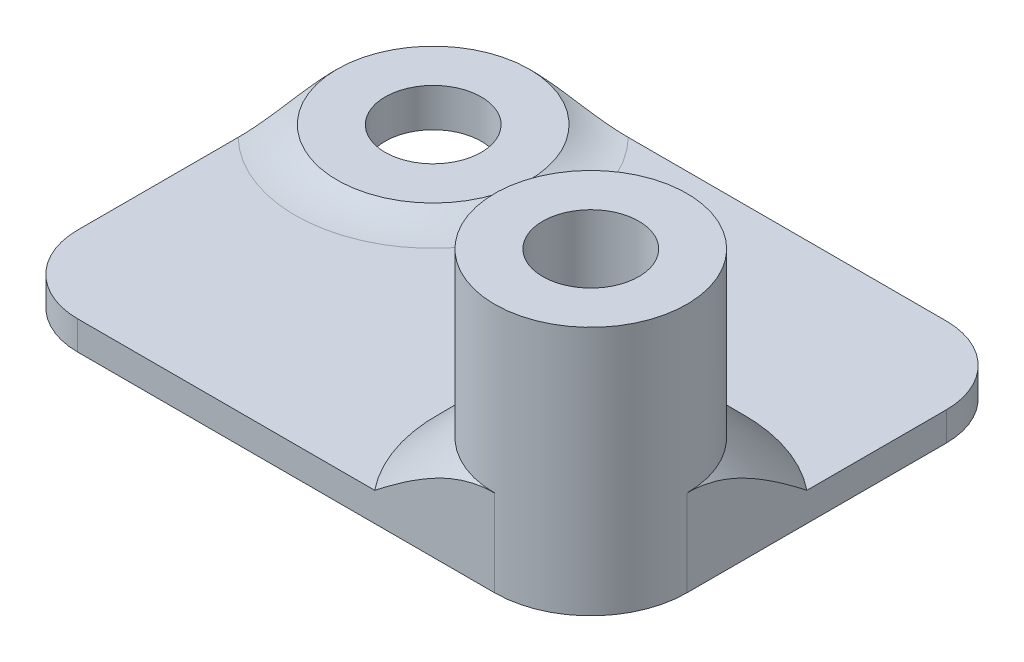
ISO-10303-21;
HEADER;
FILE_DESCRIPTION(('STEP AP214'),'2;1');
FILE_NAME('part.step','',(''),(''),'','','');
FILE_SCHEMA(('AUTOMOTIVE_DESIGN { 1 0 10303 214 1 1 1 1 }'));
ENDSEC;
DATA;
#1=APPLICATION_CONTEXT('core data for automotive mechanical design processes');
#2=APPLICATION_PROTOCOL_DEFINITION('international standard','automotive_design',2000,#1);
#3=PRODUCT_CONTEXT('',#1,'mechanical');
#4=PRODUCT('Part','Part','',(#3));
#5=PRODUCT_RELATED_PRODUCT_CATEGORY('part','',(#4));
#6=PRODUCT_DEFINITION_FORMATION('','',#4);
#7=PRODUCT_DEFINITION_CONTEXT('part definition',#1,'design');
#8=PRODUCT_DEFINITION('design','',#6,#7);
#9=PRODUCT_DEFINITION_SHAPE('','',#8);
#10=(LENGTH_UNIT() NAMED_UNIT(*) SI_UNIT(.MILLI.,.METRE.));
#11=(NAMED_UNIT(*) PLANE_ANGLE_UNIT() SI_UNIT($,.RADIAN.));
#12=(NAMED_UNIT(*) SI_UNIT($,.STERADIAN.) SOLID_ANGLE_UNIT());
#13=UNCERTAINTY_MEASURE_WITH_UNIT(LENGTH_MEASURE(1.E-05),#10,'distance_accuracy_value','');
#14=(GEOMETRIC_REPRESENTATION_CONTEXT(3) GLOBAL_UNCERTAINTY_ASSIGNED_CONTEXT((#13)) GLOBAL_UNIT_ASSIGNED_CONTEXT((#10,
#11,#12)) REPRESENTATION_CONTEXT('',''));
#15=CARTESIAN_POINT('',(0.,0.,0.));
#16=DIRECTION('',(0.,0.,1.));
#17=DIRECTION('',(1.,0.,0.));
#18=AXIS2_PLACEMENT_3D('',#15,#16,#17);
#19=CARTESIAN_POINT('',(0.,0.,0.));
#20=DIRECTION('',(0.,1.,0.));
#21=DIRECTION('',(0.,0.,1.));
#22=AXIS2_PLACEMENT_3D('',#19,#20,#21);
#23=PLANE('',#22);
#24=DIRECTION('',(0.,0.,1.));
#25=VECTOR('',#24,1.);
#26=CARTESIAN_POINT('',(-25.7,0.,0.));
#27=LINE('',#26,#25);
#28=CARTESIAN_POINT('',(-25.7,0.,-7.34786503304665));
#29=VERTEX_POINT('',#28);
#30=CARTESIAN_POINT('',(-25.7,0.,1.));
#31=VERTEX_POINT('',#30);
#32=EDGE_CURVE('E129',#29,#31,#27,.T.);
#33=ORIENTED_EDGE('',*,*,#32,.T.);
#34=CARTESIAN_POINT('',(-21.7,0.,1.));
#35=DIRECTION('',(0.,1.,0.));
#36=DIRECTION('',(0.,0.,1.));
#37=AXIS2_PLACEMENT_3D('',#34,#35,#36);
#38=CIRCLE('',#37,4.);
#39=CARTESIAN_POINT('',(-21.7,0.,5.));
#40=VERTEX_POINT('',#39);
#41=EDGE_CURVE('E232',#31,#40,#38,.T.);
#42=ORIENTED_EDGE('',*,*,#41,.T.);
#43=DIRECTION('',(1.,0.,0.));
#44=VECTOR('',#43,1.);
#45=CARTESIAN_POINT('',(0.,0.,5.));
#46=LINE('',#45,#44);
#47=CARTESIAN_POINT('',(-6.2449979983984,0.,5.));
#48=VERTEX_POINT('',#47);
#49=EDGE_CURVE('E162',#40,#48,#46,.T.);
#50=ORIENTED_EDGE('',*,*,#49,.T.);
#51=CARTESIAN_POINT('',(0.,0.,0.));
#52=DIRECTION('',(0.,1.,0.));
#53=DIRECTION('',(0.,0.,1.));
#54=AXIS2_PLACEMENT_3D('',#51,#52,#53);
#55=CIRCLE('',#54,8.);
#56=CARTESIAN_POINT('',(5.,0.,-6.2449979983984));
#57=VERTEX_POINT('',#56);
#58=EDGE_CURVE('E249',#48,#57,#55,.F.);
#59=ORIENTED_EDGE('',*,*,#58,.T.);
#60=DIRECTION('',(0.,0.,1.));
#61=VECTOR('',#60,1.);
#62=CARTESIAN_POINT('',(5.,0.,0.));
#63=LINE('',#62,#61);
#64=CARTESIAN_POINT('',(5.,0.,-13.5));
#65=VERTEX_POINT('',#64);
#66=EDGE_CURVE('E164',#65,#57,#63,.T.);
#67=ORIENTED_EDGE('',*,*,#66,.F.);
#68=CARTESIAN_POINT('',(0.999999999999998,0.,-13.5));
#69=DIRECTION('',(0.,1.,0.));
#70=DIRECTION('',(0.,0.,1.));
#71=AXIS2_PLACEMENT_3D('',#68,#69,#70);
#72=CIRCLE('',#71,4.);
#73=CARTESIAN_POINT('',(0.999999999999998,0.,-17.5));
#74=VERTEX_POINT('',#73);
#75=EDGE_CURVE('E230',#65,#74,#72,.T.);
#76=ORIENTED_EDGE('',*,*,#75,.T.);
#77=DIRECTION('',(1.,0.,0.));
#78=VECTOR('',#77,1.);
#79=CARTESIAN_POINT('',(0.,0.,-17.5));
#80=LINE('',#79,#78);
#81=CARTESIAN_POINT('',(-15.5478650330467,0.,-17.5));
#82=VERTEX_POINT('',#81);
#83=EDGE_CURVE('E167',#82,#74,#80,.T.);
#84=ORIENTED_EDGE('',*,*,#83,.F.);
#85=CARTESIAN_POINT('',(-20.7,0.,-12.5));
#86=DIRECTION('',(0.,1.,0.));
#87=DIRECTION('',(0.,0.,1.));
#88=AXIS2_PLACEMENT_3D('',#85,#86,#87);
#89=CIRCLE('',#88,7.17944947177034);
#90=EDGE_CURVE('E173',#82,#29,#89,.F.);
#91=ORIENTED_EDGE('',*,*,#90,.T.);
#92=EDGE_LOOP('',(#33,#42,#50,#59,#67,#76,#84,#91));
#93=FACE_BOUND('',#92,.T.);
#94=ADVANCED_FACE('F41',(#93),#23,.T.);
#95=CARTESIAN_POINT('',(0.,-1.5,5.));
#96=DIRECTION('',(0.,0.,1.));
#97=DIRECTION('',(1.,0.,0.));
#98=AXIS2_PLACEMENT_3D('',#95,#96,#97);
#99=PLANE('',#98);
#100=ORIENTED_EDGE('',*,*,#49,.F.);
#101=DIRECTION('',(0.,1.,0.));
#102=VECTOR('',#101,1.);
#103=CARTESIAN_POINT('',(-21.7,-1.5,5.));
#104=LINE('',#103,#102);
#105=CARTESIAN_POINT('',(-21.7,-1.5,5.));
#106=VERTEX_POINT('',#105);
#107=EDGE_CURVE('E125',#40,#106,#104,.F.);
#108=ORIENTED_EDGE('',*,*,#107,.T.);
#109=DIRECTION('',(1.,0.,0.));
#110=VECTOR('',#109,1.);
#111=CARTESIAN_POINT('',(0.,-1.5,5.));
#112=LINE('',#111,#110);
#113=CARTESIAN_POINT('',(0.,-1.5,5.));
#114=VERTEX_POINT('',#113);
#115=EDGE_CURVE('E117',#106,#114,#112,.T.);
#116=ORIENTED_EDGE('',*,*,#115,.T.);
#117=DIRECTION('',(0.,1.,0.));
#118=VECTOR('',#117,1.);
#119=CARTESIAN_POINT('',(0.,-1.5,5.));
#120=LINE('',#119,#118);
#121=CARTESIAN_POINT('',(0.,3.,5.));
#122=VERTEX_POINT('',#121);
#123=EDGE_CURVE('E122',#114,#122,#120,.T.);
#124=ORIENTED_EDGE('',*,*,#123,.T.);
#125=CARTESIAN_POINT('',(0.,3.,5.));
#126=CARTESIAN_POINT('',(-0.0768727378158432,3.00000619322757,5.));
#127=CARTESIAN_POINT('',(-0.153734047800558,2.99822628996111,5.));
#128=CARTESIAN_POINT('',(-0.307282512306507,2.99115253726289,5.));
#129=CARTESIAN_POINT('',(-0.383969693408095,2.98585926619893,5.));
#130=CARTESIAN_POINT('',(-0.613237942364165,2.9648273337264,5.));
#131=CARTESIAN_POINT('',(-0.765371607007667,2.94393602652757,5.));
#132=CARTESIAN_POINT('',(-1.06476883905343,2.88997282873731,5.));
#133=CARTESIAN_POINT('',(-1.21207129176495,2.85711114976198,5.));
#134=CARTESIAN_POINT('',(-1.50390045563061,2.78062546344547,5.));
#135=CARTESIAN_POINT('',(-1.64842579403924,2.73699627403048,5.));
#136=CARTESIAN_POINT('',(-1.94831212422469,2.63585226470975,5.));
#137=CARTESIAN_POINT('',(-2.10335323549445,2.57739758408883,5.));
#138=CARTESIAN_POINT('',(-2.40969970270666,2.45138339448191,5.));
#139=CARTESIAN_POINT('',(-2.56100399177759,2.38382132007,5.));
#140=CARTESIAN_POINT('',(-2.86029750652253,2.241183739887,5.));
#141=CARTESIAN_POINT('',(-3.00828106770316,2.16609643736009,5.));
#142=CARTESIAN_POINT('',(-3.30099443411867,2.00990435102026,5.));
#143=CARTESIAN_POINT('',(-3.44572463068959,1.92880029604338,5.));
#144=CARTESIAN_POINT('',(-3.73415125258334,1.76061013634598,5.));
#145=CARTESIAN_POINT('',(-3.87781048419049,1.67346054492644,5.));
#146=CARTESIAN_POINT('',(-4.16255106659086,1.49503861273544,5.));
#147=CARTESIAN_POINT('',(-4.30363221441498,1.40376594930734,5.));
#148=CARTESIAN_POINT('',(-4.5834119967247,1.21790998762968,5.));
#149=CARTESIAN_POINT('',(-4.72211260573008,1.12332965254982,5.));
#150=CARTESIAN_POINT('',(-4.99755126293115,0.931353365775677,5.));
#151=CARTESIAN_POINT('',(-5.13428927351718,0.833957360231655,5.));
#152=CARTESIAN_POINT('',(-5.35296882743809,0.675313273009059,5.));
#153=CARTESIAN_POINT('',(-5.4354501991818,0.614806725802505,5.));
#154=CARTESIAN_POINT('',(-5.59982830752325,0.493001638313405,5.));
#155=CARTESIAN_POINT('',(-5.6817250324473,0.431703082285041,5.));
#156=CARTESIAN_POINT('',(-5.92490378405782,0.248012046344974,5.));
#157=CARTESIAN_POINT('',(-6.08539544001867,0.124570874044579,5.));
#158=CARTESIAN_POINT('',(-6.24499799839845,0.,5.));
#159=B_SPLINE_CURVE_WITH_KNOTS('',3,(#125,#126,#127,#128,#129,#130,#131,#132,#133,#134,#135,
#136,#137,#138,#139,#140,#141,#142,#143,#144,#145,#146,#147,#148,#149,#150,#151,#152,#153,#154,
#155,#156,#157,#158),.UNSPECIFIED.,.F.,.F.,(4,2,2,2,2,2,2,2,2,2,2,2,2,2,2,2,4),(0.,
0.230575769394099,0.461113591001312,0.921155470867988,1.37348002310337,1.82602269129521,
2.32275244101165,2.81962240611028,3.31728383798525,3.81488508403918,4.31888171441685,
4.82291785429982,5.32651347329609,5.83011872994523,6.13699856631678,6.44388451314114,
7.05127016801217),.UNSPECIFIED.);
#160=EDGE_CURVE('E221',#122,#48,#159,.T.);
#161=ORIENTED_EDGE('',*,*,#160,.T.);
#162=EDGE_LOOP('',(#100,#108,#116,#124,#161));
#163=FACE_BOUND('',#162,.T.);
#164=ADVANCED_FACE('F120',(#163),#99,.T.);
#165=CARTESIAN_POINT('',(-25.7,-1.5,0.));
#166=DIRECTION('',(-1.,0.,0.));
#167=DIRECTION('',(0.,0.,1.));
#168=AXIS2_PLACEMENT_3D('',#165,#166,#167);
#169=PLANE('',#168);
#170=DIRECTION('',(0.,0.,1.));
#171=VECTOR('',#170,1.);
#172=CARTESIAN_POINT('',(-25.7,-1.5,0.));
#173=LINE('',#172,#171);
#174=CARTESIAN_POINT('',(-25.7,-1.5,-12.5));
#175=VERTEX_POINT('',#174);
#176=CARTESIAN_POINT('',(-25.7,-1.5,1.));
#177=VERTEX_POINT('',#176);
#178=EDGE_CURVE('E154',#175,#177,#173,.T.);
#179=ORIENTED_EDGE('',*,*,#178,.T.);
#180=DIRECTION('',(0.,1.,0.));
#181=VECTOR('',#180,1.);
#182=CARTESIAN_POINT('',(-25.7,-1.5,1.));
#183=LINE('',#182,#181);
#184=EDGE_CURVE('E227',#177,#31,#183,.T.);
#185=ORIENTED_EDGE('',*,*,#184,.T.);
#186=ORIENTED_EDGE('',*,*,#32,.F.);
#187=CARTESIAN_POINT('',(-25.7,0.,-7.34786503304665));
#188=CARTESIAN_POINT('',(-25.7,-3.03587121810323E-06,-7.45602355512676));
#189=CARTESIAN_POINT('',(-25.7,0.00180768444953807,-7.56416775367382));
#190=CARTESIAN_POINT('',(-25.7,0.00869621029144888,-7.78032529500459));
#191=CARTESIAN_POINT('',(-25.7,0.0137731539913038,-7.88833866477858));
#192=CARTESIAN_POINT('',(-25.7,0.0333378167610185,-8.21167325257557));
#193=CARTESIAN_POINT('',(-25.7,0.0521623232480062,-8.42673200942843));
#194=CARTESIAN_POINT('',(-25.7,0.0981307074265823,-8.85579222303389));
#195=CARTESIAN_POINT('',(-25.7,0.125270514756155,-9.06979414514632));
#196=CARTESIAN_POINT('',(-25.7,0.184183615001585,-9.49728947926875));
#197=CARTESIAN_POINT('',(-25.7,0.215960183835559,-9.71078242238922));
#198=CARTESIAN_POINT('',(-25.7,0.27993370588982,-10.1376927212384));
#199=CARTESIAN_POINT('',(-25.7,0.312130648537551,-10.3511100787301));
#200=CARTESIAN_POINT('',(-25.7,0.372317551030637,-10.778416305315));
#201=CARTESIAN_POINT('',(-25.7,0.400310649588732,-10.9923047004254));
#202=CARTESIAN_POINT('',(-25.7,0.43577815730154,-11.3139230139202));
#203=CARTESIAN_POINT('',(-25.7,0.446515490695353,-11.4212868081429));
#204=CARTESIAN_POINT('',(-25.7,0.46533124871475,-11.6362437130594));
#205=CARTESIAN_POINT('',(-25.7,0.473409840592466,-11.7438368088999));
#206=CARTESIAN_POINT('',(-25.7,0.486520477025601,-11.9594581621222));
#207=CARTESIAN_POINT('',(-25.7,0.491545540244807,-12.067486852482));
#208=CARTESIAN_POINT('',(-25.7,0.498300693880131,-12.2836748425936));
#209=CARTESIAN_POINT('',(-25.7,0.500029908081932,-12.3918341694306));
#210=CARTESIAN_POINT('',(-25.7,0.5,-12.5));
#211=B_SPLINE_CURVE_WITH_KNOTS('',3,(#187,#188,#189,#190,#191,#192,#193,#194,#195,#196,#197,
#198,#199,#200,#201,#202,#203,#204,#205,#206,#207,#208,#209,#210),.UNSPECIFIED.,.F.,.F.,(4,2,2,
2,2,2,2,2,2,2,2,4),(0.,0.324438265009519,0.648790959266105,1.29616912279004,1.9432308978923,
2.59075206214461,3.23825697225143,3.88527600667061,4.2089461793131,4.53259598710311,
4.85698300400292,5.18145624843404),.UNSPECIFIED.);
#212=CARTESIAN_POINT('',(-25.7,0.5,-12.5));
#213=VERTEX_POINT('',#212);
#214=EDGE_CURVE('E186',#29,#213,#211,.T.);
#215=ORIENTED_EDGE('',*,*,#214,.T.);
#216=DIRECTION('',(0.,1.,0.));
#217=VECTOR('',#216,1.);
#218=CARTESIAN_POINT('',(-25.7,-1.5,-12.5));
#219=LINE('',#218,#217);
#220=EDGE_CURVE('E171',#175,#213,#219,.T.);
#221=ORIENTED_EDGE('',*,*,#220,.F.);
#222=EDGE_LOOP('',(#179,#185,#186,#215,#221));
#223=FACE_BOUND('',#222,.T.);
#224=ADVANCED_FACE('F255',(#223),#169,.T.);
#225=CARTESIAN_POINT('',(-20.7,-1.5,-12.5));
#226=DIRECTION('',(0.,1.,0.));
#227=DIRECTION('',(0.,0.,1.));
#228=AXIS2_PLACEMENT_3D('',#225,#226,#227);
#229=CYLINDRICAL_SURFACE('',#228,5.);
#230=CARTESIAN_POINT('',(-20.7,0.5,-12.5));
#231=DIRECTION('',(0.,1.,0.));
#232=DIRECTION('',(0.,0.,1.));
#233=AXIS2_PLACEMENT_3D('',#230,#231,#232);
#234=CIRCLE('',#233,5.);
#235=CARTESIAN_POINT('',(-20.7,0.5,-17.5));
#236=VERTEX_POINT('',#235);
#237=EDGE_CURVE('E165',#236,#213,#234,.T.);
#238=ORIENTED_EDGE('',*,*,#237,.F.);
#239=DIRECTION('',(0.,1.,0.));
#240=VECTOR('',#239,1.);
#241=CARTESIAN_POINT('',(-20.7,-1.5,-17.5));
#242=LINE('',#241,#240);
#243=CARTESIAN_POINT('',(-20.7,-1.5,-17.5));
#244=VERTEX_POINT('',#243);
#245=EDGE_CURVE('E174',#244,#236,#242,.T.);
#246=ORIENTED_EDGE('',*,*,#245,.F.);
#247=CARTESIAN_POINT('',(-20.7,-1.5,-12.5));
#248=DIRECTION('',(0.,1.,0.));
#249=DIRECTION('',(0.,0.,1.));
#250=AXIS2_PLACEMENT_3D('',#247,#248,#249);
#251=CIRCLE('',#250,5.);
#252=EDGE_CURVE('E151',#244,#175,#251,.T.);
#253=ORIENTED_EDGE('',*,*,#252,.T.);
#254=ORIENTED_EDGE('',*,*,#220,.T.);
#255=EDGE_LOOP('',(#238,#246,#253,#254));
#256=FACE_BOUND('',#255,.T.);
#257=ADVANCED_FACE('F301',(#256),#229,.T.);
#258=CARTESIAN_POINT('',(0.,-1.5,-17.5));
#259=DIRECTION('',(0.,0.,1.));
#260=DIRECTION('',(1.,0.,0.));
#261=AXIS2_PLACEMENT_3D('',#258,#259,#260);
#262=PLANE('',#261);
#263=ORIENTED_EDGE('',*,*,#83,.T.);
#264=DIRECTION('',(0.,1.,0.));
#265=VECTOR('',#264,1.);
#266=CARTESIAN_POINT('',(0.999999999999998,-1.5,-17.5));
#267=LINE('',#266,#265);
#268=CARTESIAN_POINT('',(0.999999999999998,-1.5,-17.5));
#269=VERTEX_POINT('',#268);
#270=EDGE_CURVE('E11',#74,#269,#267,.F.);
#271=ORIENTED_EDGE('',*,*,#270,.T.);
#272=DIRECTION('',(1.,0.,0.));
#273=VECTOR('',#272,1.);
#274=CARTESIAN_POINT('',(0.,-1.5,-17.5));
#275=LINE('',#274,#273);
#276=EDGE_CURVE('E146',#244,#269,#275,.T.);
#277=ORIENTED_EDGE('',*,*,#276,.F.);
#278=ORIENTED_EDGE('',*,*,#245,.T.);
#279=CARTESIAN_POINT('',(-20.7,0.5,-17.5));
#280=CARTESIAN_POINT('',(-20.5918341694306,0.500029908081929,-17.5));
#281=CARTESIAN_POINT('',(-20.4836748425936,0.498300693880127,-17.5));
#282=CARTESIAN_POINT('',(-20.267486852482,0.491545540244802,-17.5));
#283=CARTESIAN_POINT('',(-20.1594581621222,0.486520477025597,-17.5));
#284=CARTESIAN_POINT('',(-19.9438368088999,0.473409840592463,-17.5));
#285=CARTESIAN_POINT('',(-19.8362437130594,0.465331248714747,-17.5));
#286=CARTESIAN_POINT('',(-19.6212868081429,0.44651549069535,-17.5));
#287=CARTESIAN_POINT('',(-19.5139230139203,0.435778157301536,-17.5));
#288=CARTESIAN_POINT('',(-19.1923047004254,0.400310649588728,-17.5));
#289=CARTESIAN_POINT('',(-18.978416305315,0.372317551030634,-17.5));
#290=CARTESIAN_POINT('',(-18.5511100787301,0.312130648537549,-17.5));
#291=CARTESIAN_POINT('',(-18.3376927212384,0.279933705889818,-17.5));
#292=CARTESIAN_POINT('',(-17.9107824223892,0.215960183835556,-17.5));
#293=CARTESIAN_POINT('',(-17.6972894792688,0.184183615001584,-17.5));
#294=CARTESIAN_POINT('',(-17.2697941451463,0.125270514756154,-17.5));
#295=CARTESIAN_POINT('',(-17.0557922230339,0.0981307074265807,-17.5));
#296=CARTESIAN_POINT('',(-16.6267320094284,0.0521623232480049,-17.5));
#297=CARTESIAN_POINT('',(-16.4116732525756,0.0333378167610178,-17.5));
#298=CARTESIAN_POINT('',(-16.0883386647786,0.0137731539913031,-17.5));
#299=CARTESIAN_POINT('',(-15.9803252950046,0.00869621029144802,-17.5));
#300=CARTESIAN_POINT('',(-15.7641677536738,0.00180768444953741,-17.5));
#301=CARTESIAN_POINT('',(-15.6560235551268,-3.03587121847828E-06,-17.5));
#302=CARTESIAN_POINT('',(-15.5478650330467,0.,-17.5));
#303=B_SPLINE_CURVE_WITH_KNOTS('',3,(#279,#280,#281,#282,#283,#284,#285,#286,#287,#288,#289,
#290,#291,#292,#293,#294,#295,#296,#297,#298,#299,#300,#301,#302),.UNSPECIFIED.,.F.,.F.,(4,2,2,
2,2,2,2,2,2,2,2,4),(0.,0.324473244431124,0.648860261330923,0.97251006912093,1.29618024176342,
1.94319927618261,2.59070418628943,3.23822535054173,3.885287125644,4.53266528916793,
4.85701798342452,5.18145624843403),.UNSPECIFIED.);
#304=EDGE_CURVE('E178',#236,#82,#303,.T.);
#305=ORIENTED_EDGE('',*,*,#304,.T.);
#306=EDGE_LOOP('',(#263,#271,#277,#278,#305));
#307=FACE_BOUND('',#306,.T.);
#308=ADVANCED_FACE('F193',(#307),#262,.F.);
#309=CARTESIAN_POINT('',(5.,-1.5,0.));
#310=DIRECTION('',(-1.,0.,0.));
#311=DIRECTION('',(0.,0.,1.));
#312=AXIS2_PLACEMENT_3D('',#309,#310,#311);
#313=PLANE('',#312);
#314=DIRECTION('',(0.,0.,1.));
#315=VECTOR('',#314,1.);
#316=CARTESIAN_POINT('',(5.,-1.5,0.));
#317=LINE('',#316,#315);
#318=CARTESIAN_POINT('',(5.,-1.5,-13.5));
#319=VERTEX_POINT('',#318);
#320=CARTESIAN_POINT('',(5.,-1.5,0.));
#321=VERTEX_POINT('',#320);
#322=EDGE_CURVE('E143',#319,#321,#317,.T.);
#323=ORIENTED_EDGE('',*,*,#322,.F.);
#324=DIRECTION('',(0.,1.,0.));
#325=VECTOR('',#324,1.);
#326=CARTESIAN_POINT('',(5.,-1.5,-13.5));
#327=LINE('',#326,#325);
#328=EDGE_CURVE('E49',#319,#65,#327,.T.);
#329=ORIENTED_EDGE('',*,*,#328,.T.);
#330=ORIENTED_EDGE('',*,*,#66,.T.);
#331=CARTESIAN_POINT('',(5.,0.,-6.2449979983984));
#332=CARTESIAN_POINT('',(5.,0.112449126626694,-6.10091980001845));
#333=CARTESIAN_POINT('',(5.,0.223984623871433,-5.95611850221913));
#334=CARTESIAN_POINT('',(5.,0.444826174553415,-5.66478345869934));
#335=CARTESIAN_POINT('',(5.,0.554131795683499,-5.5182493855818));
#336=CARTESIAN_POINT('',(5.,0.770706986919958,-5.22234449390284));
#337=CARTESIAN_POINT('',(5.,0.877960675089212,-5.07296201804576));
#338=CARTESIAN_POINT('',(5.,1.08917714752922,-4.77189556807964));
#339=CARTESIAN_POINT('',(5.,1.19314012237365,-4.62021172800394));
#340=CARTESIAN_POINT('',(5.,1.40188682745289,-4.30690048445462));
#341=CARTESIAN_POINT('',(5.,1.50647563735224,-4.14514267327684));
#342=CARTESIAN_POINT('',(5.,1.71016690603216,-3.8181624110321));
#343=CARTESIAN_POINT('',(5.,1.80926866128314,-3.65293951941279));
#344=CARTESIAN_POINT('',(5.,2.00030726065611,-3.3188923263544));
#345=CARTESIAN_POINT('',(5.,2.09226039955217,-3.15007740362733));
#346=CARTESIAN_POINT('',(5.,2.26736352882836,-2.80797220124427));
#347=CARTESIAN_POINT('',(5.,2.35051662774196,-2.63468352898765));
#348=CARTESIAN_POINT('',(5.,2.49793867043852,-2.30061771670835));
#349=CARTESIAN_POINT('',(5.,2.56326323974316,-2.14031023459283));
#350=CARTESIAN_POINT('',(5.,2.68274793173828,-1.81547991764178));
#351=CARTESIAN_POINT('',(5.,2.73690490530466,-1.65095590846189));
#352=CARTESIAN_POINT('',(5.,2.83110482287787,-1.31997408415389));
#353=CARTESIAN_POINT('',(5.,2.87130736501103,-1.15356226555871));
#354=CARTESIAN_POINT('',(5.,2.93623004013644,-0.817806264991223));
#355=CARTESIAN_POINT('',(5.,2.96096363921182,-0.648464765738576));
#356=CARTESIAN_POINT('',(5.,2.98472910980497,-0.399007426203679));
#357=CARTESIAN_POINT('',(5.,2.99043310948407,-0.319489497682284));
#358=CARTESIAN_POINT('',(5.,2.99807865076424,-0.159986182212054));
#359=CARTESIAN_POINT('',(5.,3.00000655955533,-0.0800001433540818));
#360=CARTESIAN_POINT('',(5.,3.,0.));
#361=B_SPLINE_CURVE_WITH_KNOTS('',3,(#331,#332,#333,#334,#335,#336,#337,#338,#339,#340,#341,
#342,#343,#344,#345,#346,#347,#348,#349,#350,#351,#352,#353,#354,#355,#356,#357,#358,#359,#360),
.UNSPECIFIED.,.F.,.F.,(4,2,2,2,2,2,2,2,2,2,2,2,2,2,4),(0.,0.548305420875447,1.09671615072987,
1.6483731010047,2.19999804473413,2.77778492105724,3.35564570830871,3.93214813261273,
4.50844622816863,5.02743010274929,5.54656012484631,6.05954040903422,6.57207350782476,
6.81116211636623,7.05111232625962),.UNSPECIFIED.);
#362=CARTESIAN_POINT('',(5.,3.,0.));
#363=VERTEX_POINT('',#362);
#364=EDGE_CURVE('E214',#57,#363,#361,.T.);
#365=ORIENTED_EDGE('',*,*,#364,.T.);
#366=DIRECTION('',(0.,1.,0.));
#367=VECTOR('',#366,1.);
#368=CARTESIAN_POINT('',(5.,-1.5,0.));
#369=LINE('',#368,#367);
#370=EDGE_CURVE('E138',#321,#363,#369,.T.);
#371=ORIENTED_EDGE('',*,*,#370,.F.);
#372=EDGE_LOOP('',(#323,#329,#330,#365,#371));
#373=FACE_BOUND('',#372,.T.);
#374=ADVANCED_FACE('F241',(#373),#313,.F.);
#375=CARTESIAN_POINT('',(-20.7,-1.5,-12.5));
#376=DIRECTION('',(0.,1.,0.));
#377=DIRECTION('',(0.,0.,1.));
#378=AXIS2_PLACEMENT_3D('',#375,#376,#377);
#379=CYLINDRICAL_SURFACE('',#378,2.5);
#380=CARTESIAN_POINT('',(-20.7,-1.5,-12.5));
#381=DIRECTION('',(0.,1.,0.));
#382=DIRECTION('',(0.,0.,1.));
#383=AXIS2_PLACEMENT_3D('',#380,#381,#382);
#384=CIRCLE('',#383,2.5);
#385=CARTESIAN_POINT('',(-20.7,-1.5,-10.));
#386=VERTEX_POINT('',#385);
#387=EDGE_CURVE('E157',#386,#386,#384,.T.);
#388=ORIENTED_EDGE('',*,*,#387,.F.);
#389=EDGE_LOOP('',(#388));
#390=FACE_BOUND('',#389,.T.);
#391=CARTESIAN_POINT('',(-20.7,0.5,-12.5));
#392=DIRECTION('',(0.,1.,0.));
#393=DIRECTION('',(0.,0.,1.));
#394=AXIS2_PLACEMENT_3D('',#391,#392,#393);
#395=CIRCLE('',#394,2.5);
#396=CARTESIAN_POINT('',(-20.7,0.5,-10.));
#397=VERTEX_POINT('',#396);
#398=EDGE_CURVE('E265',#397,#397,#395,.T.);
#399=ORIENTED_EDGE('',*,*,#398,.T.);
#400=EDGE_LOOP('',(#399));
#401=FACE_BOUND('',#400,.T.);
#402=ADVANCED_FACE('F283',(#390,#401),#379,.F.);
#403=CARTESIAN_POINT('',(0.,-1.5,0.));
#404=DIRECTION('',(0.,1.,0.));
#405=DIRECTION('',(0.,0.,1.));
#406=AXIS2_PLACEMENT_3D('',#403,#404,#405);
#407=CYLINDRICAL_SURFACE('',#406,5.);
#408=ORIENTED_EDGE('',*,*,#370,.T.);
#409=CARTESIAN_POINT('',(0.,3.,0.));
#410=DIRECTION('',(0.,1.,0.));
#411=DIRECTION('',(0.,0.,1.));
#412=AXIS2_PLACEMENT_3D('',#409,#410,#411);
#413=CIRCLE('',#412,5.);
#414=EDGE_CURVE('E136',#363,#122,#413,.T.);
#415=ORIENTED_EDGE('',*,*,#414,.T.);
#416=ORIENTED_EDGE('',*,*,#123,.F.);
#417=CARTESIAN_POINT('',(0.,-1.5,0.));
#418=DIRECTION('',(0.,1.,0.));
#419=DIRECTION('',(0.,0.,1.));
#420=AXIS2_PLACEMENT_3D('',#417,#418,#419);
#421=CIRCLE('',#420,5.);
#422=EDGE_CURVE('E128',#114,#321,#421,.T.);
#423=ORIENTED_EDGE('',*,*,#422,.T.);
#424=EDGE_LOOP('',(#408,#415,#416,#423));
#425=FACE_BOUND('',#424,.T.);
#426=CARTESIAN_POINT('',(0.,11.5,0.));
#427=DIRECTION('',(0.,1.,0.));
#428=DIRECTION('',(0.,0.,1.));
#429=AXIS2_PLACEMENT_3D('',#426,#427,#428);
#430=CIRCLE('',#429,5.);
#431=CARTESIAN_POINT('',(0.,11.5,5.));
#432=VERTEX_POINT('',#431);
#433=EDGE_CURVE('E267',#432,#432,#430,.T.);
#434=ORIENTED_EDGE('',*,*,#433,.F.);
#435=EDGE_LOOP('',(#434));
#436=FACE_BOUND('',#435,.T.);
#437=ADVANCED_FACE('F133',(#425,#436),#407,.T.);
#438=CARTESIAN_POINT('',(0.,-1.5,0.));
#439=DIRECTION('',(0.,1.,0.));
#440=DIRECTION('',(0.,0.,1.));
#441=AXIS2_PLACEMENT_3D('',#438,#439,#440);
#442=CYLINDRICAL_SURFACE('',#441,2.5);
#443=CARTESIAN_POINT('',(0.,-1.5,0.));
#444=DIRECTION('',(0.,1.,0.));
#445=DIRECTION('',(0.,0.,1.));
#446=AXIS2_PLACEMENT_3D('',#443,#444,#445);
#447=CIRCLE('',#446,2.5);
#448=CARTESIAN_POINT('',(0.,-1.5,2.5));
#449=VERTEX_POINT('',#448);
#450=EDGE_CURVE('E139',#449,#449,#447,.T.);
#451=ORIENTED_EDGE('',*,*,#450,.F.);
#452=EDGE_LOOP('',(#451));
#453=FACE_BOUND('',#452,.T.);
#454=CARTESIAN_POINT('',(0.,11.5,0.));
#455=DIRECTION('',(0.,1.,0.));
#456=DIRECTION('',(0.,0.,1.));
#457=AXIS2_PLACEMENT_3D('',#454,#455,#456);
#458=CIRCLE('',#457,2.5);
#459=CARTESIAN_POINT('',(0.,11.5,2.5));
#460=VERTEX_POINT('',#459);
#461=EDGE_CURVE('E272',#460,#460,#458,.T.);
#462=ORIENTED_EDGE('',*,*,#461,.T.);
#463=EDGE_LOOP('',(#462));
#464=FACE_BOUND('',#463,.T.);
#465=ADVANCED_FACE('F276',(#453,#464),#442,.F.);
#466=CARTESIAN_POINT('',(0.,-1.5,0.));
#467=DIRECTION('',(0.,1.,0.));
#468=DIRECTION('',(0.,0.,1.));
#469=AXIS2_PLACEMENT_3D('',#466,#467,#468);
#470=PLANE('',#469);
#471=ORIENTED_EDGE('',*,*,#115,.F.);
#472=CARTESIAN_POINT('',(-21.7,-1.5,1.));
#473=DIRECTION('',(0.,1.,0.));
#474=DIRECTION('',(0.,0.,1.));
#475=AXIS2_PLACEMENT_3D('',#472,#473,#474);
#476=CIRCLE('',#475,4.);
#477=EDGE_CURVE('E236',#106,#177,#476,.F.);
#478=ORIENTED_EDGE('',*,*,#477,.T.);
#479=ORIENTED_EDGE('',*,*,#178,.F.);
#480=ORIENTED_EDGE('',*,*,#252,.F.);
#481=ORIENTED_EDGE('',*,*,#276,.T.);
#482=CARTESIAN_POINT('',(0.999999999999998,-1.5,-13.5));
#483=DIRECTION('',(0.,1.,0.));
#484=DIRECTION('',(0.,0.,1.));
#485=AXIS2_PLACEMENT_3D('',#482,#483,#484);
#486=CIRCLE('',#485,4.);
#487=EDGE_CURVE('E56',#269,#319,#486,.F.);
#488=ORIENTED_EDGE('',*,*,#487,.T.);
#489=ORIENTED_EDGE('',*,*,#322,.T.);
#490=ORIENTED_EDGE('',*,*,#422,.F.);
#491=EDGE_LOOP('',(#471,#478,#479,#480,#481,#488,#489,#490));
#492=FACE_BOUND('',#491,.T.);
#493=ORIENTED_EDGE('',*,*,#387,.T.);
#494=EDGE_LOOP('',(#493));
#495=FACE_BOUND('',#494,.T.);
#496=ORIENTED_EDGE('',*,*,#450,.T.);
#497=EDGE_LOOP('',(#496));
#498=FACE_BOUND('',#497,.T.);
#499=ADVANCED_FACE('F141',(#492,#495,#498),#470,.F.);
#500=CARTESIAN_POINT('',(0.,0.5,0.));
#501=DIRECTION('',(0.,1.,0.));
#502=DIRECTION('',(0.,0.,1.));
#503=AXIS2_PLACEMENT_3D('',#500,#501,#502);
#504=PLANE('',#503);
#505=ORIENTED_EDGE('',*,*,#398,.F.);
#506=EDGE_LOOP('',(#505));
#507=FACE_BOUND('',#506,.T.);
#508=ORIENTED_EDGE('',*,*,#237,.T.);
#509=EDGE_CURVE('E262',#213,#236,#234,.T.);
#510=ORIENTED_EDGE('',*,*,#509,.T.);
#511=EDGE_LOOP('',(#508,#510));
#512=FACE_BOUND('',#511,.T.);
#513=ADVANCED_FACE('F261',(#507,#512),#504,.T.);
#514=CARTESIAN_POINT('',(0.,11.5,0.));
#515=DIRECTION('',(0.,1.,0.));
#516=DIRECTION('',(0.,0.,1.));
#517=AXIS2_PLACEMENT_3D('',#514,#515,#516);
#518=PLANE('',#517);
#519=ORIENTED_EDGE('',*,*,#461,.F.);
#520=EDGE_LOOP('',(#519));
#521=FACE_BOUND('',#520,.T.);
#522=ORIENTED_EDGE('',*,*,#433,.T.);
#523=EDGE_LOOP('',(#522));
#524=FACE_BOUND('',#523,.T.);
#525=ADVANCED_FACE('F203',(#521,#524),#518,.T.);
#526=CARTESIAN_POINT('',(-20.7,5.,-12.5));
#527=DIRECTION('',(0.,1.,0.));
#528=DIRECTION('',(0.,0.,1.));
#529=AXIS2_PLACEMENT_3D('',#526,#527,#528);
#530=TOROIDAL_SURFACE('',#529,7.17944947177034,5.);
#531=ORIENTED_EDGE('',*,*,#214,.F.);
#532=ORIENTED_EDGE('',*,*,#90,.F.);
#533=ORIENTED_EDGE('',*,*,#304,.F.);
#534=ORIENTED_EDGE('',*,*,#509,.F.);
#535=EDGE_LOOP('',(#531,#532,#533,#534));
#536=FACE_BOUND('',#535,.T.);
#537=ADVANCED_FACE('F197',(#536),#530,.F.);
#538=CARTESIAN_POINT('',(0.,0.,0.));
#539=DIRECTION('',(0.,-1.,0.));
#540=DIRECTION('',(0.,0.,-1.));
#541=AXIS2_PLACEMENT_3D('',#538,#539,#540);
#542=CONICAL_SURFACE('',#541,8.,0.785398163397449);
#543=ORIENTED_EDGE('',*,*,#160,.F.);
#544=ORIENTED_EDGE('',*,*,#414,.F.);
#545=ORIENTED_EDGE('',*,*,#364,.F.);
#546=ORIENTED_EDGE('',*,*,#58,.F.);
#547=EDGE_LOOP('',(#543,#544,#545,#546));
#548=FACE_BOUND('',#547,.T.);
#549=ADVANCED_FACE('F202',(#548),#542,.T.);
#550=CARTESIAN_POINT('',(-21.7,-1.5,1.));
#551=DIRECTION('',(0.,1.,0.));
#552=DIRECTION('',(0.,0.,1.));
#553=AXIS2_PLACEMENT_3D('',#550,#551,#552);
#554=CYLINDRICAL_SURFACE('',#553,4.);
#555=ORIENTED_EDGE('',*,*,#477,.F.);
#556=ORIENTED_EDGE('',*,*,#107,.F.);
#557=ORIENTED_EDGE('',*,*,#41,.F.);
#558=ORIENTED_EDGE('',*,*,#184,.F.);
#559=EDGE_LOOP('',(#555,#556,#557,#558));
#560=FACE_BOUND('',#559,.T.);
#561=ADVANCED_FACE('F210',(#560),#554,.T.);
#562=CARTESIAN_POINT('',(0.999999999999998,-1.5,-13.5));
#563=DIRECTION('',(0.,1.,0.));
#564=DIRECTION('',(0.,0.,1.));
#565=AXIS2_PLACEMENT_3D('',#562,#563,#564);
#566=CYLINDRICAL_SURFACE('',#565,4.);
#567=ORIENTED_EDGE('',*,*,#487,.F.);
#568=ORIENTED_EDGE('',*,*,#270,.F.);
#569=ORIENTED_EDGE('',*,*,#75,.F.);
#570=ORIENTED_EDGE('',*,*,#328,.F.);
#571=EDGE_LOOP('',(#567,#568,#569,#570));
#572=FACE_BOUND('',#571,.T.);
#573=ADVANCED_FACE('F43',(#572),#566,.T.);
#574=CLOSED_SHELL('',(#94,#164,#224,#257,#308,#374,#402,#437,#465,#499,#513,#525,#537,#549,#561,#573));
#575=MANIFOLD_SOLID_BREP('B2',#574);
#576=ADVANCED_BREP_SHAPE_REPRESENTATION('',(#18,#575),#14);
#577=SHAPE_DEFINITION_REPRESENTATION(#9,#576);
ENDSEC;
END-ISO-10303-21;
